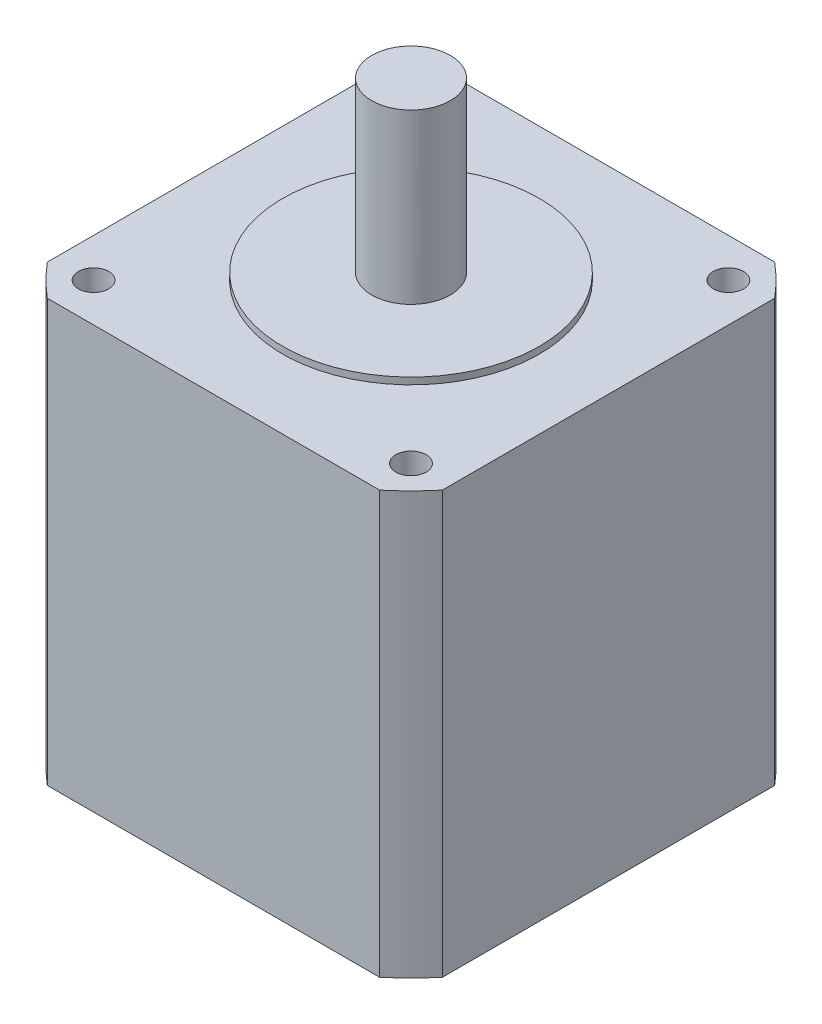
ISO-10303-21;
HEADER;
FILE_DESCRIPTION(('STEP AP214'),'2;1');
FILE_NAME('part.step','',(''),(''),'','','');
FILE_SCHEMA(('AUTOMOTIVE_DESIGN { 1 0 10303 214 1 1 1 1 }'));
ENDSEC;
DATA;
#1=APPLICATION_CONTEXT('core data for automotive mechanical design processes');
#2=APPLICATION_PROTOCOL_DEFINITION('international standard','automotive_design',2000,#1);
#3=PRODUCT_CONTEXT('',#1,'mechanical');
#4=PRODUCT('Part','Part','',(#3));
#5=PRODUCT_RELATED_PRODUCT_CATEGORY('part','',(#4));
#6=PRODUCT_DEFINITION_FORMATION('','',#4);
#7=PRODUCT_DEFINITION_CONTEXT('part definition',#1,'design');
#8=PRODUCT_DEFINITION('design','',#6,#7);
#9=PRODUCT_DEFINITION_SHAPE('','',#8);
#10=(LENGTH_UNIT() NAMED_UNIT(*) SI_UNIT(.MILLI.,.METRE.));
#11=(NAMED_UNIT(*) PLANE_ANGLE_UNIT() SI_UNIT($,.RADIAN.));
#12=(NAMED_UNIT(*) SI_UNIT($,.STERADIAN.) SOLID_ANGLE_UNIT());
#13=UNCERTAINTY_MEASURE_WITH_UNIT(LENGTH_MEASURE(1.E-05),#10,'distance_accuracy_value','');
#14=(GEOMETRIC_REPRESENTATION_CONTEXT(3) GLOBAL_UNCERTAINTY_ASSIGNED_CONTEXT((#13)) GLOBAL_UNIT_ASSIGNED_CONTEXT((#10,
#11,#12)) REPRESENTATION_CONTEXT('',''));
#15=CARTESIAN_POINT('',(0.,0.,0.));
#16=DIRECTION('',(0.,0.,1.));
#17=DIRECTION('',(1.,0.,0.));
#18=AXIS2_PLACEMENT_3D('',#15,#16,#17);
#19=CARTESIAN_POINT('',(0.,-3.,0.));
#20=DIRECTION('',(0.,1.,0.));
#21=DIRECTION('',(0.,0.,1.));
#22=AXIS2_PLACEMENT_3D('',#19,#20,#21);
#23=PLANE('',#22);
#24=CARTESIAN_POINT('',(-70.7106781186555,-3.,70.710678118654));
#25=DIRECTION('',(0.,1.,0.));
#26=DIRECTION('',(0.,0.,1.));
#27=AXIS2_PLACEMENT_3D('',#24,#25,#26);
#28=CIRCLE('',#27,6.75);
#29=CARTESIAN_POINT('',(-70.7106781186555,-3.,77.460678118654));
#30=VERTEX_POINT('',#29);
#31=EDGE_CURVE('E186',#30,#30,#28,.T.);
#32=ORIENTED_EDGE('',*,*,#31,.F.);
#33=EDGE_LOOP('',(#32));
#34=FACE_BOUND('',#33,.T.);
#35=CARTESIAN_POINT('',(70.7106781186548,-3.,70.7106781186548));
#36=DIRECTION('',(0.,1.,0.));
#37=DIRECTION('',(0.,0.,1.));
#38=AXIS2_PLACEMENT_3D('',#35,#36,#37);
#39=CIRCLE('',#38,6.75);
#40=CARTESIAN_POINT('',(70.7106781186548,-3.,77.4606781186548));
#41=VERTEX_POINT('',#40);
#42=EDGE_CURVE('E180',#41,#41,#39,.T.);
#43=ORIENTED_EDGE('',*,*,#42,.F.);
#44=EDGE_LOOP('',(#43));
#45=FACE_BOUND('',#44,.T.);
#46=CARTESIAN_POINT('',(70.710678118655,-3.,-70.7106781186545));
#47=DIRECTION('',(0.,1.,0.));
#48=DIRECTION('',(0.,0.,1.));
#49=AXIS2_PLACEMENT_3D('',#46,#47,#48);
#50=CIRCLE('',#49,6.75);
#51=CARTESIAN_POINT('',(70.710678118655,-3.,-63.9606781186545));
#52=VERTEX_POINT('',#51);
#53=EDGE_CURVE('E174',#52,#52,#50,.T.);
#54=ORIENTED_EDGE('',*,*,#53,.F.);
#55=EDGE_LOOP('',(#54));
#56=FACE_BOUND('',#55,.T.);
#57=CARTESIAN_POINT('',(-70.7106781186548,-3.,-70.7106781186548));
#58=DIRECTION('',(0.,1.,0.));
#59=DIRECTION('',(0.,0.,1.));
#60=AXIS2_PLACEMENT_3D('',#57,#58,#59);
#61=CIRCLE('',#60,6.75);
#62=CARTESIAN_POINT('',(-70.7106781186548,-3.,-63.9606781186548));
#63=VERTEX_POINT('',#62);
#64=EDGE_CURVE('E168',#63,#63,#61,.T.);
#65=ORIENTED_EDGE('',*,*,#64,.F.);
#66=EDGE_LOOP('',(#65));
#67=FACE_BOUND('',#66,.T.);
#68=CARTESIAN_POINT('',(0.,-3.,0.));
#69=DIRECTION('',(0.,-1.,0.));
#70=DIRECTION('',(0.,0.,-1.));
#71=AXIS2_PLACEMENT_3D('',#68,#69,#70);
#72=CIRCLE('',#71,57.15);
#73=CARTESIAN_POINT('',(0.,-3.,-57.15));
#74=VERTEX_POINT('',#73);
#75=EDGE_CURVE('E128',#74,#74,#72,.T.);
#76=ORIENTED_EDGE('',*,*,#75,.T.);
#77=EDGE_LOOP('',(#76));
#78=FACE_BOUND('',#77,.T.);
#79=DIRECTION('',(-1.,0.,0.));
#80=VECTOR('',#79,1.);
#81=CARTESIAN_POINT('',(-88.,-3.,88.));
#82=LINE('',#81,#80);
#83=CARTESIAN_POINT('',(74.0337760755184,-3.,88.));
#84=VERTEX_POINT('',#83);
#85=CARTESIAN_POINT('',(-74.0337760755184,-3.,88.));
#86=VERTEX_POINT('',#85);
#87=EDGE_CURVE('E123',#84,#86,#82,.T.);
#88=ORIENTED_EDGE('',*,*,#87,.F.);
#89=CARTESIAN_POINT('',(0.,-3.,0.));
#90=DIRECTION('',(0.,1.,0.));
#91=DIRECTION('',(0.,0.,1.));
#92=AXIS2_PLACEMENT_3D('',#89,#90,#91);
#93=CIRCLE('',#92,115.);
#94=CARTESIAN_POINT('',(88.,-3.,74.0337760755184));
#95=VERTEX_POINT('',#94);
#96=EDGE_CURVE('E92',#84,#95,#93,.T.);
#97=ORIENTED_EDGE('',*,*,#96,.T.);
#98=DIRECTION('',(0.,0.,1.));
#99=VECTOR('',#98,1.);
#100=CARTESIAN_POINT('',(88.,-3.,-88.));
#101=LINE('',#100,#99);
#102=CARTESIAN_POINT('',(88.,-3.,-74.0337760755184));
#103=VERTEX_POINT('',#102);
#104=EDGE_CURVE('E101',#103,#95,#101,.T.);
#105=ORIENTED_EDGE('',*,*,#104,.F.);
#106=CARTESIAN_POINT('',(74.0337760755184,-3.,-88.));
#107=VERTEX_POINT('',#106);
#108=EDGE_CURVE('E162',#103,#107,#93,.T.);
#109=ORIENTED_EDGE('',*,*,#108,.T.);
#110=DIRECTION('',(1.,0.,0.));
#111=VECTOR('',#110,1.);
#112=CARTESIAN_POINT('',(-88.,-3.,-88.));
#113=LINE('',#112,#111);
#114=CARTESIAN_POINT('',(-74.0337760755184,-3.,-88.));
#115=VERTEX_POINT('',#114);
#116=EDGE_CURVE('E108',#115,#107,#113,.T.);
#117=ORIENTED_EDGE('',*,*,#116,.F.);
#118=CARTESIAN_POINT('',(-88.,-3.,-74.0337760755184));
#119=VERTEX_POINT('',#118);
#120=EDGE_CURVE('E203',#115,#119,#93,.T.);
#121=ORIENTED_EDGE('',*,*,#120,.T.);
#122=DIRECTION('',(0.,0.,-1.));
#123=VECTOR('',#122,1.);
#124=CARTESIAN_POINT('',(-88.,-3.,-88.));
#125=LINE('',#124,#123);
#126=CARTESIAN_POINT('',(-88.,-3.,74.0337760755184));
#127=VERTEX_POINT('',#126);
#128=EDGE_CURVE('E113',#127,#119,#125,.T.);
#129=ORIENTED_EDGE('',*,*,#128,.F.);
#130=EDGE_CURVE('E163',#127,#86,#93,.T.);
#131=ORIENTED_EDGE('',*,*,#130,.T.);
#132=EDGE_LOOP('',(#88,#97,#105,#109,#117,#121,#129,#131));
#133=FACE_BOUND('',#132,.T.);
#134=ADVANCED_FACE('F17',(#34,#45,#56,#67,#78,#133),#23,.T.);
#135=CARTESIAN_POINT('',(88.,-191.,-88.));
#136=DIRECTION('',(-1.,0.,0.));
#137=DIRECTION('',(0.,0.,1.));
#138=AXIS2_PLACEMENT_3D('',#135,#136,#137);
#139=PLANE('',#138);
#140=DIRECTION('',(0.,1.,0.));
#141=VECTOR('',#140,1.);
#142=CARTESIAN_POINT('',(88.,-191.,74.0337760755184));
#143=LINE('',#142,#141);
#144=CARTESIAN_POINT('',(88.,-191.,74.0337760755184));
#145=VERTEX_POINT('',#144);
#146=EDGE_CURVE('E84',#145,#95,#143,.T.);
#147=ORIENTED_EDGE('',*,*,#146,.F.);
#148=DIRECTION('',(0.,0.,1.));
#149=VECTOR('',#148,1.);
#150=CARTESIAN_POINT('',(88.,-191.,-88.));
#151=LINE('',#150,#149);
#152=CARTESIAN_POINT('',(88.,-191.,-74.0337760755184));
#153=VERTEX_POINT('',#152);
#154=EDGE_CURVE('E99',#153,#145,#151,.T.);
#155=ORIENTED_EDGE('',*,*,#154,.F.);
#156=DIRECTION('',(0.,1.,0.));
#157=VECTOR('',#156,1.);
#158=CARTESIAN_POINT('',(88.,-191.,-74.0337760755184));
#159=LINE('',#158,#157);
#160=EDGE_CURVE('E102',#103,#153,#159,.F.);
#161=ORIENTED_EDGE('',*,*,#160,.F.);
#162=ORIENTED_EDGE('',*,*,#104,.T.);
#163=EDGE_LOOP('',(#147,#155,#161,#162));
#164=FACE_BOUND('',#163,.T.);
#165=ADVANCED_FACE('F97',(#164),#139,.F.);
#166=CARTESIAN_POINT('',(-88.,-191.,88.));
#167=DIRECTION('',(0.,0.,-1.));
#168=DIRECTION('',(-1.,0.,0.));
#169=AXIS2_PLACEMENT_3D('',#166,#167,#168);
#170=PLANE('',#169);
#171=DIRECTION('',(0.,1.,0.));
#172=VECTOR('',#171,1.);
#173=CARTESIAN_POINT('',(-74.0337760755184,-191.,88.));
#174=LINE('',#173,#172);
#175=CARTESIAN_POINT('',(-74.0337760755184,-191.,88.));
#176=VERTEX_POINT('',#175);
#177=EDGE_CURVE('E153',#176,#86,#174,.T.);
#178=ORIENTED_EDGE('',*,*,#177,.F.);
#179=DIRECTION('',(-1.,0.,0.));
#180=VECTOR('',#179,1.);
#181=CARTESIAN_POINT('',(-88.,-191.,88.));
#182=LINE('',#181,#180);
#183=CARTESIAN_POINT('',(74.0337760755184,-191.,88.));
#184=VERTEX_POINT('',#183);
#185=EDGE_CURVE('E107',#184,#176,#182,.T.);
#186=ORIENTED_EDGE('',*,*,#185,.F.);
#187=DIRECTION('',(0.,1.,0.));
#188=VECTOR('',#187,1.);
#189=CARTESIAN_POINT('',(74.0337760755184,-191.,88.));
#190=LINE('',#189,#188);
#191=EDGE_CURVE('E87',#84,#184,#190,.F.);
#192=ORIENTED_EDGE('',*,*,#191,.F.);
#193=ORIENTED_EDGE('',*,*,#87,.T.);
#194=EDGE_LOOP('',(#178,#186,#192,#193));
#195=FACE_BOUND('',#194,.T.);
#196=ADVANCED_FACE('F151',(#195),#170,.F.);
#197=CARTESIAN_POINT('',(-88.,-191.,-88.));
#198=DIRECTION('',(1.,0.,0.));
#199=DIRECTION('',(0.,0.,-1.));
#200=AXIS2_PLACEMENT_3D('',#197,#198,#199);
#201=PLANE('',#200);
#202=DIRECTION('',(0.,1.,0.));
#203=VECTOR('',#202,1.);
#204=CARTESIAN_POINT('',(-88.,-191.,-74.0337760755184));
#205=LINE('',#204,#203);
#206=CARTESIAN_POINT('',(-88.,-191.,-74.0337760755184));
#207=VERTEX_POINT('',#206);
#208=EDGE_CURVE('E142',#207,#119,#205,.T.);
#209=ORIENTED_EDGE('',*,*,#208,.F.);
#210=DIRECTION('',(0.,0.,-1.));
#211=VECTOR('',#210,1.);
#212=CARTESIAN_POINT('',(-88.,-191.,-88.));
#213=LINE('',#212,#211);
#214=CARTESIAN_POINT('',(-88.,-191.,74.0337760755184));
#215=VERTEX_POINT('',#214);
#216=EDGE_CURVE('E110',#215,#207,#213,.T.);
#217=ORIENTED_EDGE('',*,*,#216,.F.);
#218=DIRECTION('',(0.,1.,0.));
#219=VECTOR('',#218,1.);
#220=CARTESIAN_POINT('',(-88.,-191.,74.0337760755184));
#221=LINE('',#220,#219);
#222=EDGE_CURVE('E41',#127,#215,#221,.F.);
#223=ORIENTED_EDGE('',*,*,#222,.F.);
#224=ORIENTED_EDGE('',*,*,#128,.T.);
#225=EDGE_LOOP('',(#209,#217,#223,#224));
#226=FACE_BOUND('',#225,.T.);
#227=ADVANCED_FACE('F147',(#226),#201,.F.);
#228=CARTESIAN_POINT('',(-88.,-191.,-88.));
#229=DIRECTION('',(0.,0.,1.));
#230=DIRECTION('',(1.,0.,0.));
#231=AXIS2_PLACEMENT_3D('',#228,#229,#230);
#232=PLANE('',#231);
#233=DIRECTION('',(0.,1.,0.));
#234=VECTOR('',#233,1.);
#235=CARTESIAN_POINT('',(74.0337760755184,-191.,-88.));
#236=LINE('',#235,#234);
#237=CARTESIAN_POINT('',(74.0337760755184,-191.,-88.));
#238=VERTEX_POINT('',#237);
#239=EDGE_CURVE('E159',#238,#107,#236,.T.);
#240=ORIENTED_EDGE('',*,*,#239,.F.);
#241=DIRECTION('',(1.,0.,0.));
#242=VECTOR('',#241,1.);
#243=CARTESIAN_POINT('',(-88.,-191.,-88.));
#244=LINE('',#243,#242);
#245=CARTESIAN_POINT('',(-74.0337760755184,-191.,-88.));
#246=VERTEX_POINT('',#245);
#247=EDGE_CURVE('E119',#246,#238,#244,.T.);
#248=ORIENTED_EDGE('',*,*,#247,.F.);
#249=DIRECTION('',(0.,1.,0.));
#250=VECTOR('',#249,1.);
#251=CARTESIAN_POINT('',(-74.0337760755184,-191.,-88.));
#252=LINE('',#251,#250);
#253=EDGE_CURVE('E33',#115,#246,#252,.F.);
#254=ORIENTED_EDGE('',*,*,#253,.F.);
#255=ORIENTED_EDGE('',*,*,#116,.T.);
#256=EDGE_LOOP('',(#240,#248,#254,#255));
#257=FACE_BOUND('',#256,.T.);
#258=ADVANCED_FACE('F209',(#257),#232,.F.);
#259=CARTESIAN_POINT('',(0.,-191.,0.));
#260=DIRECTION('',(0.,1.,0.));
#261=DIRECTION('',(0.,0.,1.));
#262=AXIS2_PLACEMENT_3D('',#259,#260,#261);
#263=PLANE('',#262);
#264=CARTESIAN_POINT('',(-70.7106781186555,-191.,70.710678118654));
#265=DIRECTION('',(0.,1.,0.));
#266=DIRECTION('',(0.,0.,1.));
#267=AXIS2_PLACEMENT_3D('',#264,#265,#266);
#268=CIRCLE('',#267,6.75);
#269=CARTESIAN_POINT('',(-70.7106781186555,-191.,77.460678118654));
#270=VERTEX_POINT('',#269);
#271=EDGE_CURVE('E183',#270,#270,#268,.T.);
#272=ORIENTED_EDGE('',*,*,#271,.T.);
#273=EDGE_LOOP('',(#272));
#274=FACE_BOUND('',#273,.T.);
#275=CARTESIAN_POINT('',(70.7106781186548,-191.,70.7106781186548));
#276=DIRECTION('',(0.,1.,0.));
#277=DIRECTION('',(0.,0.,1.));
#278=AXIS2_PLACEMENT_3D('',#275,#276,#277);
#279=CIRCLE('',#278,6.75);
#280=CARTESIAN_POINT('',(70.7106781186548,-191.,77.4606781186548));
#281=VERTEX_POINT('',#280);
#282=EDGE_CURVE('E177',#281,#281,#279,.T.);
#283=ORIENTED_EDGE('',*,*,#282,.T.);
#284=EDGE_LOOP('',(#283));
#285=FACE_BOUND('',#284,.T.);
#286=CARTESIAN_POINT('',(70.710678118655,-191.,-70.7106781186545));
#287=DIRECTION('',(0.,1.,0.));
#288=DIRECTION('',(0.,0.,1.));
#289=AXIS2_PLACEMENT_3D('',#286,#287,#288);
#290=CIRCLE('',#289,6.75);
#291=CARTESIAN_POINT('',(70.710678118655,-191.,-63.9606781186545));
#292=VERTEX_POINT('',#291);
#293=EDGE_CURVE('E171',#292,#292,#290,.T.);
#294=ORIENTED_EDGE('',*,*,#293,.T.);
#295=EDGE_LOOP('',(#294));
#296=FACE_BOUND('',#295,.T.);
#297=CARTESIAN_POINT('',(-70.7106781186548,-191.,-70.7106781186548));
#298=DIRECTION('',(0.,1.,0.));
#299=DIRECTION('',(0.,0.,1.));
#300=AXIS2_PLACEMENT_3D('',#297,#298,#299);
#301=CIRCLE('',#300,6.75);
#302=CARTESIAN_POINT('',(-70.7106781186548,-191.,-63.9606781186548));
#303=VERTEX_POINT('',#302);
#304=EDGE_CURVE('E165',#303,#303,#301,.T.);
#305=ORIENTED_EDGE('',*,*,#304,.T.);
#306=EDGE_LOOP('',(#305));
#307=FACE_BOUND('',#306,.T.);
#308=CARTESIAN_POINT('',(0.,-191.,0.));
#309=DIRECTION('',(0.,1.,0.));
#310=DIRECTION('',(0.,0.,1.));
#311=AXIS2_PLACEMENT_3D('',#308,#309,#310);
#312=CIRCLE('',#311,115.);
#313=EDGE_CURVE('E81',#184,#145,#312,.T.);
#314=ORIENTED_EDGE('',*,*,#313,.F.);
#315=ORIENTED_EDGE('',*,*,#185,.T.);
#316=CARTESIAN_POINT('',(0.,-191.,0.));
#317=DIRECTION('',(0.,1.,0.));
#318=DIRECTION('',(0.,0.,1.));
#319=AXIS2_PLACEMENT_3D('',#316,#317,#318);
#320=CIRCLE('',#319,115.);
#321=EDGE_CURVE('E21',#215,#176,#320,.T.);
#322=ORIENTED_EDGE('',*,*,#321,.F.);
#323=ORIENTED_EDGE('',*,*,#216,.T.);
#324=EDGE_CURVE('E26',#246,#207,#320,.T.);
#325=ORIENTED_EDGE('',*,*,#324,.F.);
#326=ORIENTED_EDGE('',*,*,#247,.T.);
#327=EDGE_CURVE('E11',#153,#238,#320,.T.);
#328=ORIENTED_EDGE('',*,*,#327,.F.);
#329=ORIENTED_EDGE('',*,*,#154,.T.);
#330=EDGE_LOOP('',(#314,#315,#322,#323,#325,#326,#328,#329));
#331=FACE_BOUND('',#330,.T.);
#332=ADVANCED_FACE('F105',(#274,#285,#296,#307,#331),#263,.F.);
#333=CARTESIAN_POINT('',(0.,75.,0.));
#334=DIRECTION('',(0.,-1.,0.));
#335=DIRECTION('',(0.,0.,-1.));
#336=AXIS2_PLACEMENT_3D('',#333,#334,#335);
#337=CYLINDRICAL_SURFACE('',#336,17.5);
#338=CARTESIAN_POINT('',(0.,75.,0.));
#339=DIRECTION('',(0.,1.,0.));
#340=DIRECTION('',(0.,0.,1.));
#341=AXIS2_PLACEMENT_3D('',#338,#339,#340);
#342=CIRCLE('',#341,17.5);
#343=CARTESIAN_POINT('',(0.,75.,17.5));
#344=VERTEX_POINT('',#343);
#345=EDGE_CURVE('E135',#344,#344,#342,.T.);
#346=ORIENTED_EDGE('',*,*,#345,.F.);
#347=EDGE_LOOP('',(#346));
#348=FACE_BOUND('',#347,.T.);
#349=CARTESIAN_POINT('',(0.,0.,0.));
#350=DIRECTION('',(0.,-1.,0.));
#351=DIRECTION('',(0.,0.,-1.));
#352=AXIS2_PLACEMENT_3D('',#349,#350,#351);
#353=CIRCLE('',#352,17.5);
#354=CARTESIAN_POINT('',(0.,0.,-17.5));
#355=VERTEX_POINT('',#354);
#356=EDGE_CURVE('E131',#355,#355,#353,.T.);
#357=ORIENTED_EDGE('',*,*,#356,.F.);
#358=EDGE_LOOP('',(#357));
#359=FACE_BOUND('',#358,.T.);
#360=ADVANCED_FACE('F19',(#348,#359),#337,.T.);
#361=CARTESIAN_POINT('',(0.,75.,0.));
#362=DIRECTION('',(0.,1.,0.));
#363=DIRECTION('',(0.,0.,1.));
#364=AXIS2_PLACEMENT_3D('',#361,#362,#363);
#365=PLANE('',#364);
#366=ORIENTED_EDGE('',*,*,#345,.T.);
#367=EDGE_LOOP('',(#366));
#368=FACE_BOUND('',#367,.T.);
#369=ADVANCED_FACE('F236',(#368),#365,.T.);
#370=CARTESIAN_POINT('',(0.,0.,0.));
#371=DIRECTION('',(0.,-1.,0.));
#372=DIRECTION('',(0.,0.,-1.));
#373=AXIS2_PLACEMENT_3D('',#370,#371,#372);
#374=PLANE('',#373);
#375=CARTESIAN_POINT('',(0.,0.,0.));
#376=DIRECTION('',(0.,-1.,0.));
#377=DIRECTION('',(0.,0.,-1.));
#378=AXIS2_PLACEMENT_3D('',#375,#376,#377);
#379=CIRCLE('',#378,57.15);
#380=CARTESIAN_POINT('',(0.,0.,-57.15));
#381=VERTEX_POINT('',#380);
#382=EDGE_CURVE('E121',#381,#381,#379,.T.);
#383=ORIENTED_EDGE('',*,*,#382,.F.);
#384=EDGE_LOOP('',(#383));
#385=FACE_BOUND('',#384,.T.);
#386=ORIENTED_EDGE('',*,*,#356,.T.);
#387=EDGE_LOOP('',(#386));
#388=FACE_BOUND('',#387,.T.);
#389=ADVANCED_FACE('F229',(#385,#388),#374,.F.);
#390=CARTESIAN_POINT('',(0.,-3.,0.));
#391=DIRECTION('',(0.,1.,0.));
#392=DIRECTION('',(0.,0.,1.));
#393=AXIS2_PLACEMENT_3D('',#390,#391,#392);
#394=CYLINDRICAL_SURFACE('',#393,57.15);
#395=ORIENTED_EDGE('',*,*,#75,.F.);
#396=EDGE_LOOP('',(#395));
#397=FACE_BOUND('',#396,.T.);
#398=ORIENTED_EDGE('',*,*,#382,.T.);
#399=EDGE_LOOP('',(#398));
#400=FACE_BOUND('',#399,.T.);
#401=ADVANCED_FACE('F224',(#397,#400),#394,.T.);
#402=CARTESIAN_POINT('',(0.,-191.,0.));
#403=DIRECTION('',(0.,1.,0.));
#404=DIRECTION('',(0.,0.,1.));
#405=AXIS2_PLACEMENT_3D('',#402,#403,#404);
#406=CYLINDRICAL_SURFACE('',#405,115.);
#407=ORIENTED_EDGE('',*,*,#177,.T.);
#408=ORIENTED_EDGE('',*,*,#130,.F.);
#409=ORIENTED_EDGE('',*,*,#222,.T.);
#410=ORIENTED_EDGE('',*,*,#321,.T.);
#411=EDGE_LOOP('',(#407,#408,#409,#410));
#412=FACE_BOUND('',#411,.T.);
#413=ADVANCED_FACE('F213',(#412),#406,.T.);
#414=ORIENTED_EDGE('',*,*,#208,.T.);
#415=ORIENTED_EDGE('',*,*,#120,.F.);
#416=ORIENTED_EDGE('',*,*,#253,.T.);
#417=ORIENTED_EDGE('',*,*,#324,.T.);
#418=EDGE_LOOP('',(#414,#415,#416,#417));
#419=FACE_BOUND('',#418,.T.);
#420=ADVANCED_FACE('F141',(#419),#406,.T.);
#421=ORIENTED_EDGE('',*,*,#160,.T.);
#422=ORIENTED_EDGE('',*,*,#327,.T.);
#423=ORIENTED_EDGE('',*,*,#239,.T.);
#424=ORIENTED_EDGE('',*,*,#108,.F.);
#425=EDGE_LOOP('',(#421,#422,#423,#424));
#426=FACE_BOUND('',#425,.T.);
#427=ADVANCED_FACE('F210',(#426),#406,.T.);
#428=ORIENTED_EDGE('',*,*,#146,.T.);
#429=ORIENTED_EDGE('',*,*,#96,.F.);
#430=ORIENTED_EDGE('',*,*,#191,.T.);
#431=ORIENTED_EDGE('',*,*,#313,.T.);
#432=EDGE_LOOP('',(#428,#429,#430,#431));
#433=FACE_BOUND('',#432,.T.);
#434=ADVANCED_FACE('F83',(#433),#406,.T.);
#435=CARTESIAN_POINT('',(-70.7106781186548,-3.,-70.7106781186548));
#436=DIRECTION('',(0.,1.,0.));
#437=DIRECTION('',(0.,0.,1.));
#438=AXIS2_PLACEMENT_3D('',#435,#436,#437);
#439=CYLINDRICAL_SURFACE('',#438,6.75);
#440=ORIENTED_EDGE('',*,*,#304,.F.);
#441=EDGE_LOOP('',(#440));
#442=FACE_BOUND('',#441,.T.);
#443=ORIENTED_EDGE('',*,*,#64,.T.);
#444=EDGE_LOOP('',(#443));
#445=FACE_BOUND('',#444,.T.);
#446=ADVANCED_FACE('F220',(#442,#445),#439,.F.);
#447=CARTESIAN_POINT('',(70.710678118655,-3.,-70.7106781186545));
#448=DIRECTION('',(0.,1.,0.));
#449=DIRECTION('',(0.,0.,1.));
#450=AXIS2_PLACEMENT_3D('',#447,#448,#449);
#451=CYLINDRICAL_SURFACE('',#450,6.75);
#452=ORIENTED_EDGE('',*,*,#293,.F.);
#453=EDGE_LOOP('',(#452));
#454=FACE_BOUND('',#453,.T.);
#455=ORIENTED_EDGE('',*,*,#53,.T.);
#456=EDGE_LOOP('',(#455));
#457=FACE_BOUND('',#456,.T.);
#458=ADVANCED_FACE('F337',(#454,#457),#451,.F.);
#459=CARTESIAN_POINT('',(70.7106781186548,-3.,70.7106781186548));
#460=DIRECTION('',(0.,1.,0.));
#461=DIRECTION('',(0.,0.,1.));
#462=AXIS2_PLACEMENT_3D('',#459,#460,#461);
#463=CYLINDRICAL_SURFACE('',#462,6.75);
#464=ORIENTED_EDGE('',*,*,#282,.F.);
#465=EDGE_LOOP('',(#464));
#466=FACE_BOUND('',#465,.T.);
#467=ORIENTED_EDGE('',*,*,#42,.T.);
#468=EDGE_LOOP('',(#467));
#469=FACE_BOUND('',#468,.T.);
#470=ADVANCED_FACE('F346',(#466,#469),#463,.F.);
#471=CARTESIAN_POINT('',(-70.7106781186555,-3.,70.710678118654));
#472=DIRECTION('',(0.,1.,0.));
#473=DIRECTION('',(0.,0.,1.));
#474=AXIS2_PLACEMENT_3D('',#471,#472,#473);
#475=CYLINDRICAL_SURFACE('',#474,6.75);
#476=ORIENTED_EDGE('',*,*,#271,.F.);
#477=EDGE_LOOP('',(#476));
#478=FACE_BOUND('',#477,.T.);
#479=ORIENTED_EDGE('',*,*,#31,.T.);
#480=EDGE_LOOP('',(#479));
#481=FACE_BOUND('',#480,.T.);
#482=ADVANCED_FACE('F190',(#478,#481),#475,.F.);
#483=CLOSED_SHELL('',(#134,#165,#196,#227,#258,#332,#360,#369,#389,#401,#413,#420,#427,#434,
#446,#458,#470,#482));
#484=MANIFOLD_SOLID_BREP('B1',#483);
#485=ADVANCED_BREP_SHAPE_REPRESENTATION('',(#18,#484),#14);
#486=SHAPE_DEFINITION_REPRESENTATION(#9,#485);
ENDSEC;
END-ISO-10303-21;
